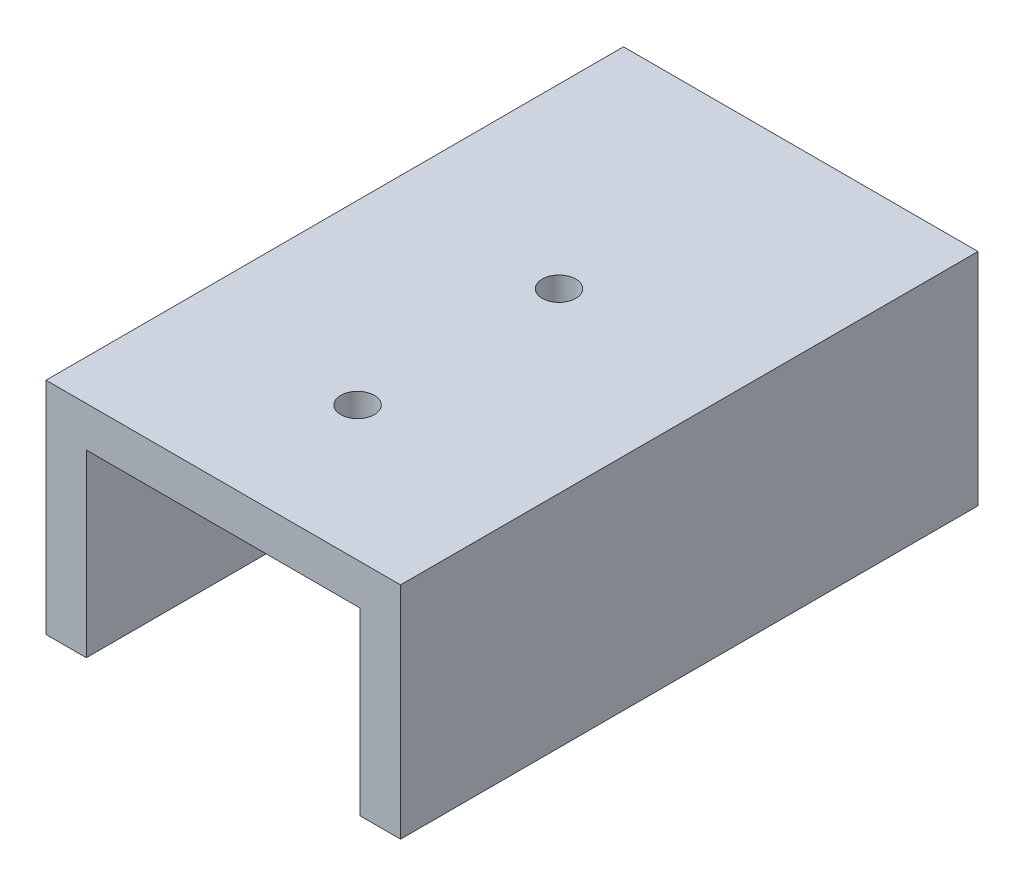
ISO-10303-21;
HEADER;
FILE_DESCRIPTION(('STEP AP214'),'2;1');
FILE_NAME('part.step','',(''),(''),'','','');
FILE_SCHEMA(('AUTOMOTIVE_DESIGN { 1 0 10303 214 1 1 1 1 }'));
ENDSEC;
DATA;
#1=APPLICATION_CONTEXT('core data for automotive mechanical design processes');
#2=APPLICATION_PROTOCOL_DEFINITION('international standard','automotive_design',2000,#1);
#3=PRODUCT_CONTEXT('',#1,'mechanical');
#4=PRODUCT('Part','Part','',(#3));
#5=PRODUCT_RELATED_PRODUCT_CATEGORY('part','',(#4));
#6=PRODUCT_DEFINITION_FORMATION('','',#4);
#7=PRODUCT_DEFINITION_CONTEXT('part definition',#1,'design');
#8=PRODUCT_DEFINITION('design','',#6,#7);
#9=PRODUCT_DEFINITION_SHAPE('','',#8);
#10=(LENGTH_UNIT() NAMED_UNIT(*) SI_UNIT(.MILLI.,.METRE.));
#11=(NAMED_UNIT(*) PLANE_ANGLE_UNIT() SI_UNIT($,.RADIAN.));
#12=(NAMED_UNIT(*) SI_UNIT($,.STERADIAN.) SOLID_ANGLE_UNIT());
#13=UNCERTAINTY_MEASURE_WITH_UNIT(LENGTH_MEASURE(1.E-05),#10,'distance_accuracy_value','');
#14=(GEOMETRIC_REPRESENTATION_CONTEXT(3) GLOBAL_UNCERTAINTY_ASSIGNED_CONTEXT((#13)) GLOBAL_UNIT_ASSIGNED_CONTEXT((#10,
#11,#12)) REPRESENTATION_CONTEXT('',''));
#15=CARTESIAN_POINT('',(0.,0.,0.));
#16=DIRECTION('',(0.,0.,1.));
#17=DIRECTION('',(1.,0.,0.));
#18=AXIS2_PLACEMENT_3D('',#15,#16,#17);
#19=CARTESIAN_POINT('',(0.,0.,40.));
#20=DIRECTION('',(0.,0.,1.));
#21=DIRECTION('',(1.,0.,0.));
#22=AXIS2_PLACEMENT_3D('',#19,#20,#21);
#23=PLANE('',#22);
#24=DIRECTION('',(0.,-1.,0.));
#25=VECTOR('',#24,1.);
#26=CARTESIAN_POINT('',(-13.2,13.2,40.));
#27=LINE('',#26,#25);
#28=CARTESIAN_POINT('',(-13.2,13.2,40.));
#29=VERTEX_POINT('',#28);
#30=CARTESIAN_POINT('',(-13.2,-3.2,40.));
#31=VERTEX_POINT('',#30);
#32=EDGE_CURVE('E118',#29,#31,#27,.T.);
#33=ORIENTED_EDGE('',*,*,#32,.T.);
#34=DIRECTION('',(-1.,0.,0.));
#35=VECTOR('',#34,1.);
#36=CARTESIAN_POINT('',(13.2,-3.2,40.));
#37=LINE('',#36,#35);
#38=CARTESIAN_POINT('',(-10.2,-3.2,40.));
#39=VERTEX_POINT('',#38);
#40=EDGE_CURVE('E108',#39,#31,#37,.T.);
#41=ORIENTED_EDGE('',*,*,#40,.F.);
#42=DIRECTION('',(0.,-1.,0.));
#43=VECTOR('',#42,1.);
#44=CARTESIAN_POINT('',(-10.2,10.2,40.));
#45=LINE('',#44,#43);
#46=CARTESIAN_POINT('',(-10.2,10.2,40.));
#47=VERTEX_POINT('',#46);
#48=EDGE_CURVE('E149',#47,#39,#45,.T.);
#49=ORIENTED_EDGE('',*,*,#48,.F.);
#50=DIRECTION('',(-1.,0.,0.));
#51=VECTOR('',#50,1.);
#52=CARTESIAN_POINT('',(-10.2,10.2,40.));
#53=LINE('',#52,#51);
#54=CARTESIAN_POINT('',(10.2,10.2,40.));
#55=VERTEX_POINT('',#54);
#56=EDGE_CURVE('E146',#55,#47,#53,.T.);
#57=ORIENTED_EDGE('',*,*,#56,.F.);
#58=DIRECTION('',(0.,1.,0.));
#59=VECTOR('',#58,1.);
#60=CARTESIAN_POINT('',(10.2,10.2,40.));
#61=LINE('',#60,#59);
#62=CARTESIAN_POINT('',(10.2,-3.2,40.));
#63=VERTEX_POINT('',#62);
#64=EDGE_CURVE('E113',#63,#55,#61,.T.);
#65=ORIENTED_EDGE('',*,*,#64,.F.);
#66=CARTESIAN_POINT('',(13.2,-3.2,40.));
#67=VERTEX_POINT('',#66);
#68=EDGE_CURVE('E101',#67,#63,#37,.T.);
#69=ORIENTED_EDGE('',*,*,#68,.F.);
#70=DIRECTION('',(0.,1.,0.));
#71=VECTOR('',#70,1.);
#72=CARTESIAN_POINT('',(13.2,13.2,40.));
#73=LINE('',#72,#71);
#74=CARTESIAN_POINT('',(13.2,13.2,40.));
#75=VERTEX_POINT('',#74);
#76=EDGE_CURVE('E111',#67,#75,#73,.T.);
#77=ORIENTED_EDGE('',*,*,#76,.T.);
#78=DIRECTION('',(-1.,0.,0.));
#79=VECTOR('',#78,1.);
#80=CARTESIAN_POINT('',(-13.2,13.2,40.));
#81=LINE('',#80,#79);
#82=EDGE_CURVE('E58',#75,#29,#81,.T.);
#83=ORIENTED_EDGE('',*,*,#82,.T.);
#84=EDGE_LOOP('',(#33,#41,#49,#57,#65,#69,#77,#83));
#85=FACE_BOUND('',#84,.T.);
#86=ADVANCED_FACE('F35',(#85),#23,.T.);
#87=CARTESIAN_POINT('',(13.2,13.2,40.));
#88=DIRECTION('',(-1.,0.,0.));
#89=DIRECTION('',(0.,-1.,0.));
#90=AXIS2_PLACEMENT_3D('',#87,#88,#89);
#91=PLANE('',#90);
#92=DIRECTION('',(0.,0.,1.));
#93=VECTOR('',#92,1.);
#94=CARTESIAN_POINT('',(13.2,-3.2,-3.));
#95=LINE('',#94,#93);
#96=CARTESIAN_POINT('',(13.2,-3.2,-3.));
#97=VERTEX_POINT('',#96);
#98=EDGE_CURVE('E98',#97,#67,#95,.T.);
#99=ORIENTED_EDGE('',*,*,#98,.F.);
#100=DIRECTION('',(0.,-1.,0.));
#101=VECTOR('',#100,1.);
#102=CARTESIAN_POINT('',(13.2,13.2,-3.));
#103=LINE('',#102,#101);
#104=CARTESIAN_POINT('',(13.2,13.2,-3.));
#105=VERTEX_POINT('',#104);
#106=EDGE_CURVE('E141',#105,#97,#103,.T.);
#107=ORIENTED_EDGE('',*,*,#106,.F.);
#108=DIRECTION('',(0.,0.,-1.));
#109=VECTOR('',#108,1.);
#110=CARTESIAN_POINT('',(13.2,13.2,40.));
#111=LINE('',#110,#109);
#112=EDGE_CURVE('E11',#75,#105,#111,.T.);
#113=ORIENTED_EDGE('',*,*,#112,.F.);
#114=ORIENTED_EDGE('',*,*,#76,.F.);
#115=EDGE_LOOP('',(#99,#107,#113,#114));
#116=FACE_BOUND('',#115,.T.);
#117=ADVANCED_FACE('F37',(#116),#91,.F.);
#118=CARTESIAN_POINT('',(-13.2,13.2,40.));
#119=DIRECTION('',(1.,0.,0.));
#120=DIRECTION('',(0.,1.,0.));
#121=AXIS2_PLACEMENT_3D('',#118,#119,#120);
#122=PLANE('',#121);
#123=DIRECTION('',(0.,0.,-1.));
#124=VECTOR('',#123,1.);
#125=CARTESIAN_POINT('',(-13.2,-3.2,-3.));
#126=LINE('',#125,#124);
#127=CARTESIAN_POINT('',(-13.2,-3.2,-3.));
#128=VERTEX_POINT('',#127);
#129=EDGE_CURVE('E50',#31,#128,#126,.T.);
#130=ORIENTED_EDGE('',*,*,#129,.F.);
#131=ORIENTED_EDGE('',*,*,#32,.F.);
#132=DIRECTION('',(0.,0.,-1.));
#133=VECTOR('',#132,1.);
#134=CARTESIAN_POINT('',(-13.2,13.2,40.));
#135=LINE('',#134,#133);
#136=CARTESIAN_POINT('',(-13.2,13.2,-3.));
#137=VERTEX_POINT('',#136);
#138=EDGE_CURVE('E43',#29,#137,#135,.T.);
#139=ORIENTED_EDGE('',*,*,#138,.T.);
#140=DIRECTION('',(0.,1.,0.));
#141=VECTOR('',#140,1.);
#142=CARTESIAN_POINT('',(-13.2,13.2,-3.));
#143=LINE('',#142,#141);
#144=EDGE_CURVE('E131',#128,#137,#143,.T.);
#145=ORIENTED_EDGE('',*,*,#144,.F.);
#146=EDGE_LOOP('',(#130,#131,#139,#145));
#147=FACE_BOUND('',#146,.T.);
#148=ADVANCED_FACE('F130',(#147),#122,.F.);
#149=CARTESIAN_POINT('',(10.2,10.2,40.));
#150=DIRECTION('',(-1.,0.,0.));
#151=DIRECTION('',(0.,-1.,0.));
#152=AXIS2_PLACEMENT_3D('',#149,#150,#151);
#153=PLANE('',#152);
#154=DIRECTION('',(0.,1.,0.));
#155=VECTOR('',#154,1.);
#156=CARTESIAN_POINT('',(10.2,10.2,0.));
#157=LINE('',#156,#155);
#158=CARTESIAN_POINT('',(10.2,-3.2,0.));
#159=VERTEX_POINT('',#158);
#160=CARTESIAN_POINT('',(10.2,10.2,0.));
#161=VERTEX_POINT('',#160);
#162=EDGE_CURVE('E137',#159,#161,#157,.T.);
#163=ORIENTED_EDGE('',*,*,#162,.F.);
#164=DIRECTION('',(0.,0.,1.));
#165=VECTOR('',#164,1.);
#166=CARTESIAN_POINT('',(10.2,-3.2,40.));
#167=LINE('',#166,#165);
#168=EDGE_CURVE('E173',#159,#63,#167,.T.);
#169=ORIENTED_EDGE('',*,*,#168,.T.);
#170=ORIENTED_EDGE('',*,*,#64,.T.);
#171=DIRECTION('',(0.,0.,-1.));
#172=VECTOR('',#171,1.);
#173=CARTESIAN_POINT('',(10.2,10.2,40.));
#174=LINE('',#173,#172);
#175=EDGE_CURVE('E116',#55,#161,#174,.T.);
#176=ORIENTED_EDGE('',*,*,#175,.T.);
#177=EDGE_LOOP('',(#163,#169,#170,#176));
#178=FACE_BOUND('',#177,.T.);
#179=ADVANCED_FACE('F172',(#178),#153,.T.);
#180=CARTESIAN_POINT('',(-10.2,10.2,40.));
#181=DIRECTION('',(1.,0.,0.));
#182=DIRECTION('',(0.,1.,0.));
#183=AXIS2_PLACEMENT_3D('',#180,#181,#182);
#184=PLANE('',#183);
#185=ORIENTED_EDGE('',*,*,#48,.T.);
#186=DIRECTION('',(0.,0.,-1.));
#187=VECTOR('',#186,1.);
#188=CARTESIAN_POINT('',(-10.2,-3.2,40.));
#189=LINE('',#188,#187);
#190=CARTESIAN_POINT('',(-10.2,-3.2,0.));
#191=VERTEX_POINT('',#190);
#192=EDGE_CURVE('E165',#39,#191,#189,.T.);
#193=ORIENTED_EDGE('',*,*,#192,.T.);
#194=DIRECTION('',(0.,-1.,0.));
#195=VECTOR('',#194,1.);
#196=CARTESIAN_POINT('',(-10.2,10.2,0.));
#197=LINE('',#196,#195);
#198=CARTESIAN_POINT('',(-10.2,10.2,0.));
#199=VERTEX_POINT('',#198);
#200=EDGE_CURVE('E147',#199,#191,#197,.T.);
#201=ORIENTED_EDGE('',*,*,#200,.F.);
#202=DIRECTION('',(0.,0.,-1.));
#203=VECTOR('',#202,1.);
#204=CARTESIAN_POINT('',(-10.2,10.2,40.));
#205=LINE('',#204,#203);
#206=EDGE_CURVE('E121',#47,#199,#205,.T.);
#207=ORIENTED_EDGE('',*,*,#206,.F.);
#208=EDGE_LOOP('',(#185,#193,#201,#207));
#209=FACE_BOUND('',#208,.T.);
#210=ADVANCED_FACE('F164',(#209),#184,.T.);
#211=CARTESIAN_POINT('',(0.,0.,0.));
#212=DIRECTION('',(0.,0.,-1.));
#213=DIRECTION('',(-1.,0.,0.));
#214=AXIS2_PLACEMENT_3D('',#211,#212,#213);
#215=PLANE('',#214);
#216=DIRECTION('',(-1.,0.,0.));
#217=VECTOR('',#216,1.);
#218=CARTESIAN_POINT('',(0.,-3.2,0.));
#219=LINE('',#218,#217);
#220=EDGE_CURVE('E170',#159,#191,#219,.T.);
#221=ORIENTED_EDGE('',*,*,#220,.F.);
#222=ORIENTED_EDGE('',*,*,#162,.T.);
#223=DIRECTION('',(-1.,0.,0.));
#224=VECTOR('',#223,1.);
#225=CARTESIAN_POINT('',(-10.2,10.2,0.));
#226=LINE('',#225,#224);
#227=EDGE_CURVE('E139',#161,#199,#226,.T.);
#228=ORIENTED_EDGE('',*,*,#227,.T.);
#229=ORIENTED_EDGE('',*,*,#200,.T.);
#230=EDGE_LOOP('',(#221,#222,#228,#229));
#231=FACE_BOUND('',#230,.T.);
#232=ADVANCED_FACE('F168',(#231),#215,.F.);
#233=CARTESIAN_POINT('',(0.,0.,-3.));
#234=DIRECTION('',(0.,0.,-1.));
#235=DIRECTION('',(-1.,0.,0.));
#236=AXIS2_PLACEMENT_3D('',#233,#234,#235);
#237=PLANE('',#236);
#238=ORIENTED_EDGE('',*,*,#106,.T.);
#239=DIRECTION('',(1.,0.,0.));
#240=VECTOR('',#239,1.);
#241=CARTESIAN_POINT('',(13.2,-3.2,-3.));
#242=LINE('',#241,#240);
#243=EDGE_CURVE('E103',#128,#97,#242,.T.);
#244=ORIENTED_EDGE('',*,*,#243,.F.);
#245=ORIENTED_EDGE('',*,*,#144,.T.);
#246=DIRECTION('',(1.,0.,0.));
#247=VECTOR('',#246,1.);
#248=CARTESIAN_POINT('',(13.2,13.2,-3.));
#249=LINE('',#248,#247);
#250=EDGE_CURVE('E134',#137,#105,#249,.T.);
#251=ORIENTED_EDGE('',*,*,#250,.T.);
#252=EDGE_LOOP('',(#238,#244,#245,#251));
#253=FACE_BOUND('',#252,.T.);
#254=ADVANCED_FACE('F192',(#253),#237,.T.);
#255=CARTESIAN_POINT('',(-13.2,13.2,40.));
#256=DIRECTION('',(0.,-1.,0.));
#257=DIRECTION('',(0.,0.,-1.));
#258=AXIS2_PLACEMENT_3D('',#255,#256,#257);
#259=PLANE('',#258);
#260=CARTESIAN_POINT('',(0.,13.2,15.));
#261=DIRECTION('',(0.,1.,0.));
#262=DIRECTION('',(0.,0.,1.));
#263=AXIS2_PLACEMENT_3D('',#260,#261,#262);
#264=CIRCLE('',#263,1.25);
#265=CARTESIAN_POINT('',(0.,13.2,16.25));
#266=VERTEX_POINT('',#265);
#267=EDGE_CURVE('E185',#266,#266,#264,.T.);
#268=ORIENTED_EDGE('',*,*,#267,.F.);
#269=EDGE_LOOP('',(#268));
#270=FACE_BOUND('',#269,.T.);
#271=CARTESIAN_POINT('',(0.,13.2,30.));
#272=DIRECTION('',(0.,1.,0.));
#273=DIRECTION('',(0.,0.,1.));
#274=AXIS2_PLACEMENT_3D('',#271,#272,#273);
#275=CIRCLE('',#274,1.25);
#276=CARTESIAN_POINT('',(0.,13.2,31.25));
#277=VERTEX_POINT('',#276);
#278=EDGE_CURVE('E188',#277,#277,#275,.T.);
#279=ORIENTED_EDGE('',*,*,#278,.F.);
#280=EDGE_LOOP('',(#279));
#281=FACE_BOUND('',#280,.T.);
#282=ORIENTED_EDGE('',*,*,#112,.T.);
#283=ORIENTED_EDGE('',*,*,#250,.F.);
#284=ORIENTED_EDGE('',*,*,#138,.F.);
#285=ORIENTED_EDGE('',*,*,#82,.F.);
#286=EDGE_LOOP('',(#282,#283,#284,#285));
#287=FACE_BOUND('',#286,.T.);
#288=ADVANCED_FACE('F135',(#270,#281,#287),#259,.F.);
#289=CARTESIAN_POINT('',(-10.2,10.2,40.));
#290=DIRECTION('',(0.,-1.,0.));
#291=DIRECTION('',(0.,0.,-1.));
#292=AXIS2_PLACEMENT_3D('',#289,#290,#291);
#293=PLANE('',#292);
#294=CARTESIAN_POINT('',(0.,10.2,15.));
#295=DIRECTION('',(0.,1.,0.));
#296=DIRECTION('',(0.,0.,1.));
#297=AXIS2_PLACEMENT_3D('',#294,#295,#296);
#298=CIRCLE('',#297,1.25);
#299=CARTESIAN_POINT('',(0.,10.2,16.25));
#300=VERTEX_POINT('',#299);
#301=EDGE_CURVE('E182',#300,#300,#298,.T.);
#302=ORIENTED_EDGE('',*,*,#301,.T.);
#303=EDGE_LOOP('',(#302));
#304=FACE_BOUND('',#303,.T.);
#305=CARTESIAN_POINT('',(0.,10.2,30.));
#306=DIRECTION('',(0.,1.,0.));
#307=DIRECTION('',(0.,0.,1.));
#308=AXIS2_PLACEMENT_3D('',#305,#306,#307);
#309=CIRCLE('',#308,1.25);
#310=CARTESIAN_POINT('',(0.,10.2,31.25));
#311=VERTEX_POINT('',#310);
#312=EDGE_CURVE('E181',#311,#311,#309,.T.);
#313=ORIENTED_EDGE('',*,*,#312,.T.);
#314=EDGE_LOOP('',(#313));
#315=FACE_BOUND('',#314,.T.);
#316=ORIENTED_EDGE('',*,*,#227,.F.);
#317=ORIENTED_EDGE('',*,*,#175,.F.);
#318=ORIENTED_EDGE('',*,*,#56,.T.);
#319=ORIENTED_EDGE('',*,*,#206,.T.);
#320=EDGE_LOOP('',(#316,#317,#318,#319));
#321=FACE_BOUND('',#320,.T.);
#322=ADVANCED_FACE('F159',(#304,#315,#321),#293,.T.);
#323=CARTESIAN_POINT('',(0.,10.2,30.));
#324=DIRECTION('',(0.,1.,0.));
#325=DIRECTION('',(0.,0.,1.));
#326=AXIS2_PLACEMENT_3D('',#323,#324,#325);
#327=CYLINDRICAL_SURFACE('',#326,1.25);
#328=ORIENTED_EDGE('',*,*,#312,.F.);
#329=EDGE_LOOP('',(#328));
#330=FACE_BOUND('',#329,.T.);
#331=ORIENTED_EDGE('',*,*,#278,.T.);
#332=EDGE_LOOP('',(#331));
#333=FACE_BOUND('',#332,.T.);
#334=ADVANCED_FACE('F223',(#330,#333),#327,.F.);
#335=CARTESIAN_POINT('',(0.,10.2,15.));
#336=DIRECTION('',(0.,1.,0.));
#337=DIRECTION('',(0.,0.,1.));
#338=AXIS2_PLACEMENT_3D('',#335,#336,#337);
#339=CYLINDRICAL_SURFACE('',#338,1.25);
#340=ORIENTED_EDGE('',*,*,#301,.F.);
#341=EDGE_LOOP('',(#340));
#342=FACE_BOUND('',#341,.T.);
#343=ORIENTED_EDGE('',*,*,#267,.T.);
#344=EDGE_LOOP('',(#343));
#345=FACE_BOUND('',#344,.T.);
#346=ADVANCED_FACE('F228',(#342,#345),#339,.F.);
#347=CARTESIAN_POINT('',(0.,-3.2,0.));
#348=DIRECTION('',(0.,-1.,0.));
#349=DIRECTION('',(0.,0.,-1.));
#350=AXIS2_PLACEMENT_3D('',#347,#348,#349);
#351=PLANE('',#350);
#352=ORIENTED_EDGE('',*,*,#220,.T.);
#353=ORIENTED_EDGE('',*,*,#192,.F.);
#354=ORIENTED_EDGE('',*,*,#40,.T.);
#355=ORIENTED_EDGE('',*,*,#129,.T.);
#356=ORIENTED_EDGE('',*,*,#243,.T.);
#357=ORIENTED_EDGE('',*,*,#98,.T.);
#358=ORIENTED_EDGE('',*,*,#68,.T.);
#359=ORIENTED_EDGE('',*,*,#168,.F.);
#360=EDGE_LOOP('',(#352,#353,#354,#355,#356,#357,#358,#359));
#361=FACE_BOUND('',#360,.T.);
#362=ADVANCED_FACE('F100',(#361),#351,.T.);
#363=CLOSED_SHELL('',(#86,#117,#148,#179,#210,#232,#254,#288,#322,#334,#346,#362));
#364=MANIFOLD_SOLID_BREP('B2',#363);
#365=ADVANCED_BREP_SHAPE_REPRESENTATION('',(#18,#364),#14);
#366=SHAPE_DEFINITION_REPRESENTATION(#9,#365);
ENDSEC;
END-ISO-10303-21;
